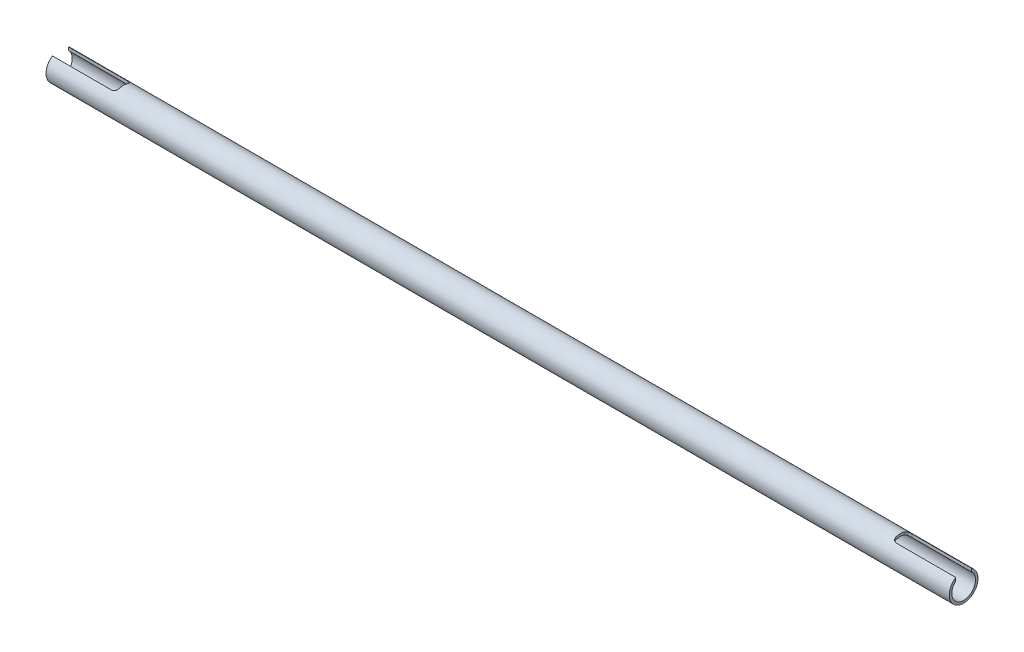
ISO-10303-21;
HEADER;
FILE_DESCRIPTION(('STEP AP214'),'2;1');
FILE_NAME('part.step','',(''),(''),'','','');
FILE_SCHEMA(('AUTOMOTIVE_DESIGN { 1 0 10303 214 1 1 1 1 }'));
ENDSEC;
DATA;
#1=APPLICATION_CONTEXT('core data for automotive mechanical design processes');
#2=APPLICATION_PROTOCOL_DEFINITION('international standard','automotive_design',2000,#1);
#3=PRODUCT_CONTEXT('',#1,'mechanical');
#4=PRODUCT('Part','Part','',(#3));
#5=PRODUCT_RELATED_PRODUCT_CATEGORY('part','',(#4));
#6=PRODUCT_DEFINITION_FORMATION('','',#4);
#7=PRODUCT_DEFINITION_CONTEXT('part definition',#1,'design');
#8=PRODUCT_DEFINITION('design','',#6,#7);
#9=PRODUCT_DEFINITION_SHAPE('','',#8);
#10=(LENGTH_UNIT() NAMED_UNIT(*) SI_UNIT(.MILLI.,.METRE.));
#11=(NAMED_UNIT(*) PLANE_ANGLE_UNIT() SI_UNIT($,.RADIAN.));
#12=(NAMED_UNIT(*) SI_UNIT($,.STERADIAN.) SOLID_ANGLE_UNIT());
#13=UNCERTAINTY_MEASURE_WITH_UNIT(LENGTH_MEASURE(1.E-05),#10,'distance_accuracy_value','');
#14=(GEOMETRIC_REPRESENTATION_CONTEXT(3) GLOBAL_UNCERTAINTY_ASSIGNED_CONTEXT((#13)) GLOBAL_UNIT_ASSIGNED_CONTEXT((#10,
#11,#12)) REPRESENTATION_CONTEXT('',''));
#15=CARTESIAN_POINT('',(0.,0.,0.));
#16=DIRECTION('',(0.,0.,1.));
#17=DIRECTION('',(1.,0.,0.));
#18=AXIS2_PLACEMENT_3D('',#15,#16,#17);
#19=CARTESIAN_POINT('',(362.5,0.,0.));
#20=DIRECTION('',(1.,0.,0.));
#21=DIRECTION('',(0.,0.,-1.));
#22=AXIS2_PLACEMENT_3D('',#19,#20,#21);
#23=PLANE('',#22);
#24=CARTESIAN_POINT('',(362.5,0.,0.));
#25=DIRECTION('',(1.,0.,0.));
#26=DIRECTION('',(0.,0.,-1.));
#27=AXIS2_PLACEMENT_3D('',#24,#25,#26);
#28=CIRCLE('',#27,9.525);
#29=CARTESIAN_POINT('',(362.5,7.09951582856183,6.35));
#30=VERTEX_POINT('',#29);
#31=CARTESIAN_POINT('',(362.5,7.09951582856183,-6.35));
#32=VERTEX_POINT('',#31);
#33=EDGE_CURVE('E227',#30,#32,#28,.T.);
#34=ORIENTED_EDGE('',*,*,#33,.F.);
#35=DIRECTION('',(0.,-1.,0.));
#36=VECTOR('',#35,1.);
#37=CARTESIAN_POINT('',(362.5,23.,6.35));
#38=LINE('',#37,#36);
#39=CARTESIAN_POINT('',(362.5,9.61785449047759,6.35));
#40=VERTEX_POINT('',#39);
#41=EDGE_CURVE('E251',#40,#30,#38,.T.);
#42=ORIENTED_EDGE('',*,*,#41,.F.);
#43=CARTESIAN_POINT('',(362.5,0.,0.));
#44=DIRECTION('',(1.,0.,0.));
#45=DIRECTION('',(0.,0.,-1.));
#46=AXIS2_PLACEMENT_3D('',#43,#44,#45);
#47=CIRCLE('',#46,11.525);
#48=CARTESIAN_POINT('',(362.5,9.61785449047759,-6.35));
#49=VERTEX_POINT('',#48);
#50=EDGE_CURVE('E226',#40,#49,#47,.T.);
#51=ORIENTED_EDGE('',*,*,#50,.T.);
#52=DIRECTION('',(0.,-1.,0.));
#53=VECTOR('',#52,1.);
#54=CARTESIAN_POINT('',(362.5,23.,-6.35));
#55=LINE('',#54,#53);
#56=EDGE_CURVE('E244',#49,#32,#55,.T.);
#57=ORIENTED_EDGE('',*,*,#56,.T.);
#58=EDGE_LOOP('',(#34,#42,#51,#57));
#59=FACE_BOUND('',#58,.T.);
#60=ADVANCED_FACE('F38',(#59),#23,.T.);
#61=CARTESIAN_POINT('',(362.5,0.,0.));
#62=DIRECTION('',(-1.,0.,0.));
#63=DIRECTION('',(0.,0.,1.));
#64=AXIS2_PLACEMENT_3D('',#61,#62,#63);
#65=CYLINDRICAL_SURFACE('',#64,11.525);
#66=CARTESIAN_POINT('',(-362.5,0.,0.));
#67=DIRECTION('',(1.,0.,0.));
#68=DIRECTION('',(0.,0.,-1.));
#69=AXIS2_PLACEMENT_3D('',#66,#67,#68);
#70=CIRCLE('',#69,11.525);
#71=CARTESIAN_POINT('',(-362.5,9.61785449047759,6.35));
#72=VERTEX_POINT('',#71);
#73=CARTESIAN_POINT('',(-362.5,9.61785449047759,-6.35));
#74=VERTEX_POINT('',#73);
#75=EDGE_CURVE('E220',#72,#74,#70,.T.);
#76=ORIENTED_EDGE('',*,*,#75,.T.);
#77=DIRECTION('',(-1.,0.,0.));
#78=VECTOR('',#77,1.);
#79=CARTESIAN_POINT('',(362.5,9.61785449047759,-6.35));
#80=LINE('',#79,#78);
#81=CARTESIAN_POINT('',(-314.7,9.61785449047759,-6.35));
#82=VERTEX_POINT('',#81);
#83=EDGE_CURVE('E225',#74,#82,#80,.F.);
#84=ORIENTED_EDGE('',*,*,#83,.T.);
#85=CARTESIAN_POINT('',(-314.7,9.61785449047759,-6.35));
#86=CARTESIAN_POINT('',(-314.62412960931,9.61783719008871,-6.35001472411667));
#87=CARTESIAN_POINT('',(-314.54827077058,9.61975425390792,-6.34712232960108));
#88=CARTESIAN_POINT('',(-314.3972164236,9.6273259624087,-6.33563774736336));
#89=CARTESIAN_POINT('',(-314.322020555645,9.63297843544727,-6.32704887137609));
#90=CARTESIAN_POINT('',(-314.173292998488,9.64784509930453,-6.30435421613493));
#91=CARTESIAN_POINT('',(-314.099754004671,9.65703758917539,-6.29028204438159));
#92=CARTESIAN_POINT('',(-313.954408404781,9.67874466115362,-6.25683016434463));
#93=CARTESIAN_POINT('',(-313.882601975339,9.69125958042864,-6.2374499173792));
#94=CARTESIAN_POINT('',(-313.670785610698,9.73331230611268,-6.17178841932299));
#95=CARTESIAN_POINT('',(-313.533941576399,9.76740431728918,-6.11791795596803));
#96=CARTESIAN_POINT('',(-313.271649200573,9.84504819496624,-5.99216901227246));
#97=CARTESIAN_POINT('',(-313.146217923362,9.88861390722428,-5.92026415092508));
#98=CARTESIAN_POINT('',(-312.898739976851,9.98631689231128,-5.75405301697405));
#99=CARTESIAN_POINT('',(-312.777839271345,10.0410316107989,-5.65838237134446));
#100=CARTESIAN_POINT('',(-312.553150852299,10.1550781405946,-5.45105734997949));
#101=CARTESIAN_POINT('',(-312.449371591058,10.2144122111794,-5.33939513023337));
#102=CARTESIAN_POINT('',(-312.2465423585,10.3436090390283,-5.08512494753548));
#103=CARTESIAN_POINT('',(-312.150341627472,10.4137544869434,-4.94037681869321));
#104=CARTESIAN_POINT('',(-311.984115861906,10.5527373731332,-4.63609012273654));
#105=CARTESIAN_POINT('',(-311.914080864379,10.6215752997702,-4.47655721408168));
#106=CARTESIAN_POINT('',(-311.806547118443,10.7498163622024,-4.1586214014769));
#107=CARTESIAN_POINT('',(-311.766979253961,10.8095388926176,-4.00105501246837));
#108=CARTESIAN_POINT('',(-311.727020190474,10.8947568249706,-3.7599498811021));
#109=CARTESIAN_POINT('',(-311.716932267182,10.9224610864076,-3.67870391729896));
#110=CARTESIAN_POINT('',(-311.703420935863,10.9762135146012,-3.51508164635891));
#111=CARTESIAN_POINT('',(-311.700000298136,11.0022609886054,-3.43270488367787));
#112=CARTESIAN_POINT('',(-311.7,11.0273806953419,-3.35000000000001));
#113=B_SPLINE_CURVE_WITH_KNOTS('',3,(#85,#86,#87,#88,#89,#90,#91,#92,#93,#94,#95,#96,#97,#98,
#99,#100,#101,#102,#103,#104,#105,#106,#107,#108,#109,#110,#111,#112),.UNSPECIFIED.,.F.,.F.,(4,
2,2,2,2,2,2,2,2,2,2,2,2,4),(0.,0.227512894422188,0.454893636618366,0.680902129078979,
0.906933566165684,1.35767920180695,1.80908808076627,2.29798152095593,2.78711559437471,
3.34691433939575,3.90649971503392,4.42353402025813,4.68257823588544,4.94173006312893),.UNSPECIFIED.);
#114=CARTESIAN_POINT('',(-311.7,11.0273806953419,-3.35));
#115=VERTEX_POINT('',#114);
#116=EDGE_CURVE('E159',#82,#115,#113,.T.);
#117=ORIENTED_EDGE('',*,*,#116,.T.);
#118=CARTESIAN_POINT('',(-311.7,0.,0.));
#119=DIRECTION('',(1.,0.,0.));
#120=DIRECTION('',(0.,0.,-1.));
#121=AXIS2_PLACEMENT_3D('',#118,#119,#120);
#122=CIRCLE('',#121,11.525);
#123=CARTESIAN_POINT('',(-311.7,11.0273806953419,3.35));
#124=VERTEX_POINT('',#123);
#125=EDGE_CURVE('E155',#115,#124,#122,.T.);
#126=ORIENTED_EDGE('',*,*,#125,.T.);
#127=CARTESIAN_POINT('',(-311.7,11.0273806953419,3.35));
#128=CARTESIAN_POINT('',(-311.699993208499,11.0001263085442,3.43975217585381));
#129=CARTESIAN_POINT('',(-311.704027212755,10.9717618693023,3.52914500616861));
#130=CARTESIAN_POINT('',(-311.719934401097,10.9131020957586,3.70654634253026));
#131=CARTESIAN_POINT('',(-311.731803958667,10.8828076605708,3.79455546971065));
#132=CARTESIAN_POINT('',(-311.763095785526,10.8206397797251,3.96836081202152));
#133=CARTESIAN_POINT('',(-311.782496511445,10.7887710623248,4.0541626015112));
#134=CARTESIAN_POINT('',(-311.82857038764,10.7237094949895,4.22325730293904));
#135=CARTESIAN_POINT('',(-311.855244320164,10.6905165029541,4.30654994394265));
#136=CARTESIAN_POINT('',(-311.94567754982,10.58957801452,4.55165066080173));
#137=CARTESIAN_POINT('',(-312.019926278698,10.5203198786257,4.70910536853686));
#138=CARTESIAN_POINT('',(-312.194275291003,10.3810113305893,5.00875725376151));
#139=CARTESIAN_POINT('',(-312.294408333043,10.3109600228368,5.15093477161695));
#140=CARTESIAN_POINT('',(-312.5236424303,10.1707080438531,5.42279760428362));
#141=CARTESIAN_POINT('',(-312.653848636423,10.1006438547074,5.5516273229986));
#142=CARTESIAN_POINT('',(-312.938052258396,9.96881586884745,5.78500737848692));
#143=CARTESIAN_POINT('',(-313.09202438018,9.90704337646225,5.88958323591414));
#144=CARTESIAN_POINT('',(-313.386236237145,9.80900621875348,6.0511182034491));
#145=CARTESIAN_POINT('',(-313.522652945437,9.77010852572037,6.11345867654304));
#146=CARTESIAN_POINT('',(-313.805678692531,9.70420466035408,6.21754395162758));
#147=CARTESIAN_POINT('',(-313.952264469234,9.67717232091228,6.25933409878355));
#148=CARTESIAN_POINT('',(-314.199749147572,9.64438338940511,6.30968062199532));
#149=CARTESIAN_POINT('',(-314.298826142137,9.63449793434078,6.32473908429372));
#150=CARTESIAN_POINT('',(-314.49857408183,9.62120627862089,6.34492369432358));
#151=CARTESIAN_POINT('',(-314.599247361353,9.61781066281704,6.35003361635539));
#152=CARTESIAN_POINT('',(-314.7,9.61785449047759,6.35));
#153=B_SPLINE_CURVE_WITH_KNOTS('',3,(#127,#128,#129,#130,#131,#132,#133,#134,#135,#136,#137,
#138,#139,#140,#141,#142,#143,#144,#145,#146,#147,#148,#149,#150,#151,#152),.UNSPECIFIED.,.F.,
.F.,(4,2,2,2,2,2,2,2,2,2,2,2,4),(0.,0.281270895631947,0.562411702341072,0.842754145409989,
1.12312675176706,1.6825164674415,2.24261763024737,2.82804584304815,3.41285522696497,
3.87581629897958,4.33775119200564,4.63918880793522,4.94111764692505),.UNSPECIFIED.);
#154=CARTESIAN_POINT('',(-314.7,9.61785449047759,6.35));
#155=VERTEX_POINT('',#154);
#156=EDGE_CURVE('E146',#124,#155,#153,.T.);
#157=ORIENTED_EDGE('',*,*,#156,.T.);
#158=DIRECTION('',(-1.,0.,0.));
#159=VECTOR('',#158,1.);
#160=CARTESIAN_POINT('',(362.5,9.61785449047759,6.35));
#161=LINE('',#160,#159);
#162=EDGE_CURVE('E132',#155,#72,#161,.T.);
#163=ORIENTED_EDGE('',*,*,#162,.T.);
#164=EDGE_LOOP('',(#76,#84,#117,#126,#157,#163));
#165=FACE_BOUND('',#164,.T.);
#166=DIRECTION('',(-1.,0.,0.));
#167=VECTOR('',#166,1.);
#168=CARTESIAN_POINT('',(362.5,9.61785449047759,6.35));
#169=LINE('',#168,#167);
#170=CARTESIAN_POINT('',(314.7,9.61785449047759,6.35));
#171=VERTEX_POINT('',#170);
#172=EDGE_CURVE('E392',#171,#40,#169,.F.);
#173=ORIENTED_EDGE('',*,*,#172,.F.);
#174=CARTESIAN_POINT('',(311.7,11.0273806953419,3.35));
#175=CARTESIAN_POINT('',(311.699993208499,11.0001263085442,3.43975217585381));
#176=CARTESIAN_POINT('',(311.704027212755,10.9717618693023,3.52914500616861));
#177=CARTESIAN_POINT('',(311.719934401097,10.9131020957586,3.70654634253026));
#178=CARTESIAN_POINT('',(311.731803958667,10.8828076605708,3.79455546971065));
#179=CARTESIAN_POINT('',(311.763095785526,10.8206397797251,3.96836081202152));
#180=CARTESIAN_POINT('',(311.782496511445,10.7887710623248,4.0541626015112));
#181=CARTESIAN_POINT('',(311.82857038764,10.7237094949895,4.22325730293904));
#182=CARTESIAN_POINT('',(311.855244320164,10.6905165029541,4.30654994394265));
#183=CARTESIAN_POINT('',(311.94567754982,10.58957801452,4.55165066080173));
#184=CARTESIAN_POINT('',(312.019926278698,10.5203198786257,4.70910536853686));
#185=CARTESIAN_POINT('',(312.194275291003,10.3810113305893,5.00875725376151));
#186=CARTESIAN_POINT('',(312.294408333043,10.3109600228368,5.15093477161695));
#187=CARTESIAN_POINT('',(312.5236424303,10.1707080438531,5.42279760428362));
#188=CARTESIAN_POINT('',(312.653848636423,10.1006438547074,5.55162732299859));
#189=CARTESIAN_POINT('',(312.938052258396,9.96881586884745,5.78500737848692));
#190=CARTESIAN_POINT('',(313.09202438018,9.90704337646226,5.88958323591413));
#191=CARTESIAN_POINT('',(313.386236237145,9.80900621875348,6.0511182034491));
#192=CARTESIAN_POINT('',(313.522652945437,9.77010852572037,6.11345867654304));
#193=CARTESIAN_POINT('',(313.805678692531,9.70420466035408,6.21754395162758));
#194=CARTESIAN_POINT('',(313.952264469234,9.67717232091228,6.25933409878355));
#195=CARTESIAN_POINT('',(314.199749147572,9.64438338940511,6.30968062199532));
#196=CARTESIAN_POINT('',(314.298826142137,9.63449793434078,6.32473908429372));
#197=CARTESIAN_POINT('',(314.49857408183,9.62120627862089,6.34492369432358));
#198=CARTESIAN_POINT('',(314.599247361353,9.61781066281704,6.35003361635539));
#199=CARTESIAN_POINT('',(314.7,9.61785449047759,6.35));
#200=B_SPLINE_CURVE_WITH_KNOTS('',3,(#174,#175,#176,#177,#178,#179,#180,#181,#182,#183,#184,
#185,#186,#187,#188,#189,#190,#191,#192,#193,#194,#195,#196,#197,#198,#199),.UNSPECIFIED.,.F.,
.F.,(4,2,2,2,2,2,2,2,2,2,2,2,4),(0.,0.281270895631947,0.562411702341071,0.842754145409988,
1.12312675176706,1.6825164674415,2.24261763024737,2.82804584304814,3.41285522696497,
3.87581629897958,4.33775119200564,4.63918880793522,4.94111764692505),.UNSPECIFIED.);
#201=CARTESIAN_POINT('',(311.7,11.0273806953419,3.35));
#202=VERTEX_POINT('',#201);
#203=EDGE_CURVE('E391',#202,#171,#200,.T.);
#204=ORIENTED_EDGE('',*,*,#203,.F.);
#205=CARTESIAN_POINT('',(311.7,0.,0.));
#206=DIRECTION('',(1.,0.,0.));
#207=DIRECTION('',(0.,0.,-1.));
#208=AXIS2_PLACEMENT_3D('',#205,#206,#207);
#209=CIRCLE('',#208,11.525);
#210=CARTESIAN_POINT('',(311.7,11.0273806953419,-3.35));
#211=VERTEX_POINT('',#210);
#212=EDGE_CURVE('E259',#211,#202,#209,.T.);
#213=ORIENTED_EDGE('',*,*,#212,.F.);
#214=CARTESIAN_POINT('',(314.7,9.61785449047759,-6.35));
#215=CARTESIAN_POINT('',(314.62412960931,9.61783719008871,-6.35001472411667));
#216=CARTESIAN_POINT('',(314.54827077058,9.61975425390792,-6.34712232960108));
#217=CARTESIAN_POINT('',(314.3972164236,9.6273259624087,-6.33563774736336));
#218=CARTESIAN_POINT('',(314.322020555645,9.63297843544727,-6.32704887137609));
#219=CARTESIAN_POINT('',(314.173292998488,9.64784509930453,-6.30435421613493));
#220=CARTESIAN_POINT('',(314.099754004671,9.65703758917539,-6.29028204438159));
#221=CARTESIAN_POINT('',(313.954408404781,9.67874466115362,-6.25683016434463));
#222=CARTESIAN_POINT('',(313.882601975339,9.69125958042864,-6.2374499173792));
#223=CARTESIAN_POINT('',(313.670785610698,9.73331230611268,-6.17178841932299));
#224=CARTESIAN_POINT('',(313.533941576399,9.76740431728918,-6.11791795596803));
#225=CARTESIAN_POINT('',(313.271649200573,9.84504819496624,-5.99216901227246));
#226=CARTESIAN_POINT('',(313.146217923362,9.88861390722428,-5.92026415092508));
#227=CARTESIAN_POINT('',(312.898739976851,9.98631689231128,-5.75405301697405));
#228=CARTESIAN_POINT('',(312.777839271345,10.0410316107989,-5.65838237134446));
#229=CARTESIAN_POINT('',(312.553150852299,10.1550781405946,-5.45105734997949));
#230=CARTESIAN_POINT('',(312.449371591058,10.2144122111794,-5.33939513023337));
#231=CARTESIAN_POINT('',(312.2465423585,10.3436090390283,-5.08512494753548));
#232=CARTESIAN_POINT('',(312.150341627472,10.4137544869434,-4.94037681869321));
#233=CARTESIAN_POINT('',(311.984115861906,10.5527373731332,-4.63609012273654));
#234=CARTESIAN_POINT('',(311.914080864379,10.6215752997702,-4.47655721408168));
#235=CARTESIAN_POINT('',(311.806547118443,10.7498163622024,-4.1586214014769));
#236=CARTESIAN_POINT('',(311.766979253961,10.8095388926176,-4.00105501246837));
#237=CARTESIAN_POINT('',(311.727020190474,10.8947568249706,-3.7599498811021));
#238=CARTESIAN_POINT('',(311.716932267182,10.9224610864076,-3.67870391729896));
#239=CARTESIAN_POINT('',(311.703420935863,10.9762135146012,-3.51508164635891));
#240=CARTESIAN_POINT('',(311.700000298136,11.0022609886054,-3.43270488367787));
#241=CARTESIAN_POINT('',(311.7,11.0273806953419,-3.35000000000001));
#242=B_SPLINE_CURVE_WITH_KNOTS('',3,(#214,#215,#216,#217,#218,#219,#220,#221,#222,#223,#224,
#225,#226,#227,#228,#229,#230,#231,#232,#233,#234,#235,#236,#237,#238,#239,#240,#241),
.UNSPECIFIED.,.F.,.F.,(4,2,2,2,2,2,2,2,2,2,2,2,2,4),(0.,0.227512894422188,0.454893636618366,
0.680902129078979,0.906933566165684,1.35767920180695,1.80908808076627,2.29798152095593,
2.78711559437471,3.34691433939575,3.90649971503392,4.42353402025813,4.68257823588544,
4.94173006312893),.UNSPECIFIED.);
#243=CARTESIAN_POINT('',(314.7,9.61785449047759,-6.35));
#244=VERTEX_POINT('',#243);
#245=EDGE_CURVE('E261',#244,#211,#242,.T.);
#246=ORIENTED_EDGE('',*,*,#245,.F.);
#247=DIRECTION('',(-1.,0.,0.));
#248=VECTOR('',#247,1.);
#249=CARTESIAN_POINT('',(362.5,9.61785449047759,-6.35));
#250=LINE('',#249,#248);
#251=EDGE_CURVE('E267',#49,#244,#250,.T.);
#252=ORIENTED_EDGE('',*,*,#251,.F.);
#253=ORIENTED_EDGE('',*,*,#50,.F.);
#254=EDGE_LOOP('',(#173,#204,#213,#246,#252,#253));
#255=FACE_BOUND('',#254,.T.);
#256=ADVANCED_FACE('F40',(#165,#255),#65,.T.);
#257=CARTESIAN_POINT('',(362.5,0.,0.));
#258=DIRECTION('',(-1.,0.,0.));
#259=DIRECTION('',(0.,0.,1.));
#260=AXIS2_PLACEMENT_3D('',#257,#258,#259);
#261=CYLINDRICAL_SURFACE('',#260,9.525);
#262=DIRECTION('',(-1.,0.,0.));
#263=VECTOR('',#262,1.);
#264=CARTESIAN_POINT('',(362.5,7.09951582856183,-6.35));
#265=LINE('',#264,#263);
#266=CARTESIAN_POINT('',(-362.5,7.09951582856183,-6.35));
#267=VERTEX_POINT('',#266);
#268=CARTESIAN_POINT('',(-314.7,7.09951582856183,-6.35));
#269=VERTEX_POINT('',#268);
#270=EDGE_CURVE('E141',#267,#269,#265,.F.);
#271=ORIENTED_EDGE('',*,*,#270,.F.);
#272=CARTESIAN_POINT('',(-362.5,0.,0.));
#273=DIRECTION('',(1.,0.,0.));
#274=DIRECTION('',(0.,0.,-1.));
#275=AXIS2_PLACEMENT_3D('',#272,#273,#274);
#276=CIRCLE('',#275,9.525);
#277=CARTESIAN_POINT('',(-362.5,7.09951582856183,6.35));
#278=VERTEX_POINT('',#277);
#279=EDGE_CURVE('E221',#278,#267,#276,.T.);
#280=ORIENTED_EDGE('',*,*,#279,.F.);
#281=DIRECTION('',(-1.,0.,0.));
#282=VECTOR('',#281,1.);
#283=CARTESIAN_POINT('',(362.5,7.09951582856183,6.35));
#284=LINE('',#283,#282);
#285=CARTESIAN_POINT('',(-314.7,7.09951582856183,6.35));
#286=VERTEX_POINT('',#285);
#287=EDGE_CURVE('E60',#286,#278,#284,.T.);
#288=ORIENTED_EDGE('',*,*,#287,.F.);
#289=CARTESIAN_POINT('',(-311.7,8.91645248963959,3.35));
#290=CARTESIAN_POINT('',(-311.69999419947,8.8818133827646,3.44223674694686));
#291=CARTESIAN_POINT('',(-311.70425295962,8.84572840474698,3.53389568235868));
#292=CARTESIAN_POINT('',(-311.720940031107,8.77104768551315,3.7153594717705));
#293=CARTESIAN_POINT('',(-311.733362657839,8.73245370818274,3.80516557107828));
#294=CARTESIAN_POINT('',(-311.765945416305,8.65326531770397,3.98195674716842));
#295=CARTESIAN_POINT('',(-311.786070487711,8.61268068505288,4.06895269741342));
#296=CARTESIAN_POINT('',(-311.833690056649,8.52976000706419,4.24003202532091));
#297=CARTESIAN_POINT('',(-311.861185823325,8.48742366116595,4.32411489856941));
#298=CARTESIAN_POINT('',(-311.9540396367,8.35865211019002,4.57086370919536));
#299=CARTESIAN_POINT('',(-312.029882736928,8.27017249079528,4.72865270482178));
#300=CARTESIAN_POINT('',(-312.207303316797,8.09146315822358,5.02836422927802));
#301=CARTESIAN_POINT('',(-312.308940195304,8.00122985561017,5.17024903104908));
#302=CARTESIAN_POINT('',(-312.545576273424,7.81626332210504,5.44622731548924));
#303=CARTESIAN_POINT('',(-312.682623308474,7.72176508014306,5.57873616702757));
#304=CARTESIAN_POINT('',(-312.983482026674,7.54322946007962,5.81786165218977));
#305=CARTESIAN_POINT('',(-313.147240701975,7.45917193333469,5.92452854657346));
#306=CARTESIAN_POINT('',(-313.443470340225,7.33455526577063,6.07753215774176));
#307=CARTESIAN_POINT('',(-313.569369255277,7.28865863957872,6.13227122003551));
#308=CARTESIAN_POINT('',(-313.830891218717,7.20990597404448,6.22467516710594));
#309=CARTESIAN_POINT('',(-313.966482674094,7.17700966066748,6.26239283530609));
#310=CARTESIAN_POINT('',(-314.202090418856,7.13510501710948,6.31003760122699));
#311=CARTESIAN_POINT('',(-314.300363638329,7.12187265268512,6.32493010847517));
#312=CARTESIAN_POINT('',(-314.449265744603,7.10851914587797,6.33992286420476));
#313=CARTESIAN_POINT('',(-314.499261355536,7.10515027868153,6.34369626505408));
#314=CARTESIAN_POINT('',(-314.599500440839,7.10064571075004,6.34873692594193));
#315=CARTESIAN_POINT('',(-314.649744013545,7.0995109817958,6.35000309541398));
#316=CARTESIAN_POINT('',(-314.7,7.09951582856183,6.35));
#317=B_SPLINE_CURVE_WITH_KNOTS('',3,(#289,#290,#291,#292,#293,#294,#295,#296,#297,#298,#299,
#300,#301,#302,#303,#304,#305,#306,#307,#308,#309,#310,#311,#312,#313,#314,#315,#316),
.UNSPECIFIED.,.F.,.F.,(4,2,2,2,2,2,2,2,2,2,2,2,2,4),(0.,0.295427016411927,0.590648540845026,
0.884541944648256,1.17848598579095,1.76431676351331,2.35150905344247,2.98669419011853,
3.62063383673795,4.05331509888894,4.48464523595347,4.78460200076217,4.93525196988146,
5.08596745259809),.UNSPECIFIED.);
#318=CARTESIAN_POINT('',(-311.7,8.91645248963959,3.35));
#319=VERTEX_POINT('',#318);
#320=EDGE_CURVE('E149',#319,#286,#317,.T.);
#321=ORIENTED_EDGE('',*,*,#320,.F.);
#322=CARTESIAN_POINT('',(-311.7,0.,0.));
#323=DIRECTION('',(1.,0.,0.));
#324=DIRECTION('',(0.,0.,-1.));
#325=AXIS2_PLACEMENT_3D('',#322,#323,#324);
#326=CIRCLE('',#325,9.525);
#327=CARTESIAN_POINT('',(-311.7,8.91645248963959,-3.35));
#328=VERTEX_POINT('',#327);
#329=EDGE_CURVE('E53',#328,#319,#326,.T.);
#330=ORIENTED_EDGE('',*,*,#329,.F.);
#331=CARTESIAN_POINT('',(-314.7,7.09951582856183,-6.35));
#332=CARTESIAN_POINT('',(-314.628390232265,7.0994899573347,-6.35001769397443));
#333=CARTESIAN_POINT('',(-314.556797812089,7.10180832665333,-6.34743670790289));
#334=CARTESIAN_POINT('',(-314.414331380451,7.11093530961771,-6.33721615513459));
#335=CARTESIAN_POINT('',(-314.34345673377,7.11773952109074,-6.32958154776992));
#336=CARTESIAN_POINT('',(-314.203622533591,7.13555711341919,-6.30948626904966));
#337=CARTESIAN_POINT('',(-314.134651279064,7.14653061014128,-6.29707131269739));
#338=CARTESIAN_POINT('',(-313.998443240532,7.17234819663722,-6.26764952518838));
#339=CARTESIAN_POINT('',(-313.931206801296,7.18719304937186,-6.25064178887029));
#340=CARTESIAN_POINT('',(-313.733243647496,7.23682336250806,-6.19326778435097));
#341=CARTESIAN_POINT('',(-313.605612907853,7.27679339891072,-6.14645369508387));
#342=CARTESIAN_POINT('',(-313.360681968999,7.36719411020138,-6.03780376343484));
#343=CARTESIAN_POINT('',(-313.243412376624,7.41765439178555,-5.97592531838702));
#344=CARTESIAN_POINT('',(-312.976960316844,7.54682127131796,-5.81254682578315));
#345=CARTESIAN_POINT('',(-312.833095550896,7.62888249832065,-5.70499554048867));
#346=CARTESIAN_POINT('',(-312.568736430176,7.79996313575545,-5.46877833150821));
#347=CARTESIAN_POINT('',(-312.448272105942,7.88899128429844,-5.34008566202805));
#348=CARTESIAN_POINT('',(-312.230679499167,8.06975267487284,-5.06284636644103));
#349=CARTESIAN_POINT('',(-312.133841794811,8.16150540439471,-4.91408438601498));
#350=CARTESIAN_POINT('',(-311.967437154291,8.34211658106605,-4.60079667144817));
#351=CARTESIAN_POINT('',(-311.897821196621,8.43097996424495,-4.43629994414141));
#352=CARTESIAN_POINT('',(-311.796630919955,8.58917173479988,-4.12043919172949));
#353=CARTESIAN_POINT('',(-311.760881700234,8.65941590781578,-3.9708816675839));
#354=CARTESIAN_POINT('',(-311.72463956736,8.75979385344815,-3.74147795952469));
#355=CARTESIAN_POINT('',(-311.715455141673,8.79246723319337,-3.66404497230159));
#356=CARTESIAN_POINT('',(-311.703133688538,8.85592878991926,-3.50788767058444));
#357=CARTESIAN_POINT('',(-311.700000005344,8.88671591526829,-3.42916266621668));
#358=CARTESIAN_POINT('',(-311.7,8.91645248963959,-3.35));
#359=B_SPLINE_CURVE_WITH_KNOTS('',3,(#331,#332,#333,#334,#335,#336,#337,#338,#339,#340,#341,
#342,#343,#344,#345,#346,#347,#348,#349,#350,#351,#352,#353,#354,#355,#356,#357,#358),
.UNSPECIFIED.,.F.,.F.,(4,2,2,2,2,2,2,2,2,2,2,2,2,4),(0.,0.214717200178695,0.429224001065765,
0.641728450073734,0.854274810816653,1.27740345086943,1.70174290913525,2.29105350527228,
2.88111545738386,3.47810495661701,4.07401437796675,4.57931100382107,4.83272414441315,
5.0862773067596),.UNSPECIFIED.);
#360=EDGE_CURVE('E12',#269,#328,#359,.T.);
#361=ORIENTED_EDGE('',*,*,#360,.F.);
#362=EDGE_LOOP('',(#271,#280,#288,#321,#330,#361));
#363=FACE_BOUND('',#362,.T.);
#364=CARTESIAN_POINT('',(311.7,8.91645248963959,3.35));
#365=CARTESIAN_POINT('',(311.69999419947,8.88181338276459,3.44223674694686));
#366=CARTESIAN_POINT('',(311.70425295962,8.84572840474698,3.53389568235868));
#367=CARTESIAN_POINT('',(311.720940031107,8.77104768551315,3.7153594717705));
#368=CARTESIAN_POINT('',(311.733362657839,8.73245370818274,3.80516557107828));
#369=CARTESIAN_POINT('',(311.765945416305,8.65326531770397,3.98195674716842));
#370=CARTESIAN_POINT('',(311.786070487711,8.61268068505287,4.06895269741343));
#371=CARTESIAN_POINT('',(311.833690056649,8.52976000706419,4.24003202532092));
#372=CARTESIAN_POINT('',(311.861185823325,8.48742366116595,4.32411489856941));
#373=CARTESIAN_POINT('',(311.9540396367,8.35865211019003,4.57086370919536));
#374=CARTESIAN_POINT('',(312.029882736928,8.27017249079528,4.72865270482178));
#375=CARTESIAN_POINT('',(312.207303316797,8.09146315822358,5.02836422927802));
#376=CARTESIAN_POINT('',(312.308940195304,8.00122985561017,5.17024903104908));
#377=CARTESIAN_POINT('',(312.545576273424,7.81626332210505,5.44622731548922));
#378=CARTESIAN_POINT('',(312.682623308473,7.72176508014308,5.57873616702755));
#379=CARTESIAN_POINT('',(312.983482026674,7.54322946007964,5.81786165218975));
#380=CARTESIAN_POINT('',(313.147240701975,7.45917193333469,5.92452854657345));
#381=CARTESIAN_POINT('',(313.443470340225,7.33455526577063,6.07753215774176));
#382=CARTESIAN_POINT('',(313.569369255277,7.28865863957872,6.13227122003551));
#383=CARTESIAN_POINT('',(313.830891218717,7.20990597404448,6.22467516710594));
#384=CARTESIAN_POINT('',(313.966482674094,7.17700966066748,6.26239283530609));
#385=CARTESIAN_POINT('',(314.202090418856,7.13510501710948,6.31003760122699));
#386=CARTESIAN_POINT('',(314.300363638329,7.12187265268512,6.32493010847517));
#387=CARTESIAN_POINT('',(314.449265744603,7.10851914587797,6.33992286420476));
#388=CARTESIAN_POINT('',(314.499261355536,7.10515027868153,6.34369626505408));
#389=CARTESIAN_POINT('',(314.599500440839,7.10064571075004,6.34873692594193));
#390=CARTESIAN_POINT('',(314.649744013545,7.0995109817958,6.35000309541398));
#391=CARTESIAN_POINT('',(314.7,7.09951582856183,6.35));
#392=B_SPLINE_CURVE_WITH_KNOTS('',3,(#364,#365,#366,#367,#368,#369,#370,#371,#372,#373,#374,
#375,#376,#377,#378,#379,#380,#381,#382,#383,#384,#385,#386,#387,#388,#389,#390,#391),
.UNSPECIFIED.,.F.,.F.,(4,2,2,2,2,2,2,2,2,2,2,2,2,4),(0.,0.295427016411927,0.590648540845024,
0.884541944648268,1.17848598579096,1.76431676351332,2.35150905344247,2.98669419011846,
3.62063383673795,4.05331509888894,4.48464523595347,4.78460200076217,4.93525196988146,
5.0859674525981),.UNSPECIFIED.);
#393=CARTESIAN_POINT('',(311.7,8.91645248963959,3.35));
#394=VERTEX_POINT('',#393);
#395=CARTESIAN_POINT('',(314.7,7.09951582856183,6.35));
#396=VERTEX_POINT('',#395);
#397=EDGE_CURVE('E206',#394,#396,#392,.T.);
#398=ORIENTED_EDGE('',*,*,#397,.T.);
#399=DIRECTION('',(-1.,0.,0.));
#400=VECTOR('',#399,1.);
#401=CARTESIAN_POINT('',(362.5,7.09951582856183,6.35));
#402=LINE('',#401,#400);
#403=EDGE_CURVE('E213',#396,#30,#402,.F.);
#404=ORIENTED_EDGE('',*,*,#403,.T.);
#405=ORIENTED_EDGE('',*,*,#33,.T.);
#406=DIRECTION('',(-1.,0.,0.));
#407=VECTOR('',#406,1.);
#408=CARTESIAN_POINT('',(362.5,7.09951582856183,-6.35));
#409=LINE('',#408,#407);
#410=CARTESIAN_POINT('',(314.7,7.09951582856183,-6.35));
#411=VERTEX_POINT('',#410);
#412=EDGE_CURVE('E214',#32,#411,#409,.T.);
#413=ORIENTED_EDGE('',*,*,#412,.T.);
#414=CARTESIAN_POINT('',(314.7,7.09951582856183,-6.35));
#415=CARTESIAN_POINT('',(314.628390232265,7.0994899573347,-6.35001769397443));
#416=CARTESIAN_POINT('',(314.556797812089,7.10180832665333,-6.34743670790289));
#417=CARTESIAN_POINT('',(314.414331380451,7.11093530961771,-6.33721615513459));
#418=CARTESIAN_POINT('',(314.34345673377,7.11773952109074,-6.32958154776992));
#419=CARTESIAN_POINT('',(314.203622533591,7.13555711341919,-6.30948626904966));
#420=CARTESIAN_POINT('',(314.134651279064,7.14653061014128,-6.29707131269739));
#421=CARTESIAN_POINT('',(313.998443240532,7.17234819663722,-6.26764952518838));
#422=CARTESIAN_POINT('',(313.931206801296,7.18719304937186,-6.25064178887029));
#423=CARTESIAN_POINT('',(313.733243647496,7.23682336250806,-6.19326778435097));
#424=CARTESIAN_POINT('',(313.605612907853,7.27679339891072,-6.14645369508387));
#425=CARTESIAN_POINT('',(313.360681968999,7.36719411020138,-6.03780376343484));
#426=CARTESIAN_POINT('',(313.243412376624,7.41765439178555,-5.97592531838702));
#427=CARTESIAN_POINT('',(312.976960316844,7.54682127131796,-5.81254682578315));
#428=CARTESIAN_POINT('',(312.833095550896,7.62888249832065,-5.70499554048867));
#429=CARTESIAN_POINT('',(312.568736430176,7.79996313575545,-5.46877833150821));
#430=CARTESIAN_POINT('',(312.448272105942,7.88899128429844,-5.34008566202805));
#431=CARTESIAN_POINT('',(312.230679499167,8.06975267487284,-5.06284636644103));
#432=CARTESIAN_POINT('',(312.133841794811,8.16150540439471,-4.91408438601498));
#433=CARTESIAN_POINT('',(311.967437154291,8.34211658106605,-4.60079667144817));
#434=CARTESIAN_POINT('',(311.897821196621,8.43097996424495,-4.43629994414141));
#435=CARTESIAN_POINT('',(311.796630919955,8.58917173479988,-4.12043919172949));
#436=CARTESIAN_POINT('',(311.760881700234,8.65941590781578,-3.9708816675839));
#437=CARTESIAN_POINT('',(311.72463956736,8.75979385344815,-3.74147795952469));
#438=CARTESIAN_POINT('',(311.715455141673,8.79246723319337,-3.66404497230158));
#439=CARTESIAN_POINT('',(311.703133688538,8.85592878991926,-3.50788767058444));
#440=CARTESIAN_POINT('',(311.700000005344,8.88671591526829,-3.42916266621668));
#441=CARTESIAN_POINT('',(311.7,8.91645248963959,-3.35));
#442=B_SPLINE_CURVE_WITH_KNOTS('',3,(#414,#415,#416,#417,#418,#419,#420,#421,#422,#423,#424,
#425,#426,#427,#428,#429,#430,#431,#432,#433,#434,#435,#436,#437,#438,#439,#440,#441),
.UNSPECIFIED.,.F.,.F.,(4,2,2,2,2,2,2,2,2,2,2,2,2,4),(0.,0.214717200178695,0.429224001065765,
0.641728450073734,0.854274810816653,1.27740345086943,1.70174290913525,2.29105350527228,
2.88111545738386,3.47810495661701,4.07401437796675,4.57931100382107,4.83272414441315,
5.0862773067596),.UNSPECIFIED.);
#443=CARTESIAN_POINT('',(311.7,8.91645248963959,-3.35));
#444=VERTEX_POINT('',#443);
#445=EDGE_CURVE('E197',#411,#444,#442,.T.);
#446=ORIENTED_EDGE('',*,*,#445,.T.);
#447=CARTESIAN_POINT('',(311.7,0.,0.));
#448=DIRECTION('',(1.,0.,0.));
#449=DIRECTION('',(0.,0.,-1.));
#450=AXIS2_PLACEMENT_3D('',#447,#448,#449);
#451=CIRCLE('',#450,9.525);
#452=EDGE_CURVE('E230',#444,#394,#451,.T.);
#453=ORIENTED_EDGE('',*,*,#452,.T.);
#454=EDGE_LOOP('',(#398,#404,#405,#413,#446,#453));
#455=FACE_BOUND('',#454,.T.);
#456=ADVANCED_FACE('F184',(#363,#455),#261,.F.);
#457=CARTESIAN_POINT('',(-362.5,0.,0.));
#458=DIRECTION('',(1.,0.,0.));
#459=DIRECTION('',(0.,0.,-1.));
#460=AXIS2_PLACEMENT_3D('',#457,#458,#459);
#461=PLANE('',#460);
#462=ORIENTED_EDGE('',*,*,#279,.T.);
#463=DIRECTION('',(0.,1.,0.));
#464=VECTOR('',#463,1.);
#465=CARTESIAN_POINT('',(-362.5,0.,-6.35));
#466=LINE('',#465,#464);
#467=EDGE_CURVE('E182',#267,#74,#466,.T.);
#468=ORIENTED_EDGE('',*,*,#467,.T.);
#469=ORIENTED_EDGE('',*,*,#75,.F.);
#470=DIRECTION('',(0.,-1.,0.));
#471=VECTOR('',#470,1.);
#472=CARTESIAN_POINT('',(-362.5,0.,6.35));
#473=LINE('',#472,#471);
#474=EDGE_CURVE('E136',#72,#278,#473,.T.);
#475=ORIENTED_EDGE('',*,*,#474,.T.);
#476=EDGE_LOOP('',(#462,#468,#469,#475));
#477=FACE_BOUND('',#476,.T.);
#478=ADVANCED_FACE('F189',(#477),#461,.F.);
#479=CARTESIAN_POINT('',(314.7,23.,3.35));
#480=DIRECTION('',(0.,-1.,0.));
#481=DIRECTION('',(0.,0.,-1.));
#482=AXIS2_PLACEMENT_3D('',#479,#480,#481);
#483=CYLINDRICAL_SURFACE('',#482,3.);
#484=ORIENTED_EDGE('',*,*,#203,.T.);
#485=DIRECTION('',(0.,-1.,0.));
#486=VECTOR('',#485,1.);
#487=CARTESIAN_POINT('',(314.7,23.,6.35));
#488=LINE('',#487,#486);
#489=EDGE_CURVE('E253',#171,#396,#488,.T.);
#490=ORIENTED_EDGE('',*,*,#489,.T.);
#491=ORIENTED_EDGE('',*,*,#397,.F.);
#492=DIRECTION('',(0.,-1.,0.));
#493=VECTOR('',#492,1.);
#494=CARTESIAN_POINT('',(311.7,23.,3.35));
#495=LINE('',#494,#493);
#496=EDGE_CURVE('E68',#202,#394,#495,.T.);
#497=ORIENTED_EDGE('',*,*,#496,.F.);
#498=EDGE_LOOP('',(#484,#490,#491,#497));
#499=FACE_BOUND('',#498,.T.);
#500=ADVANCED_FACE('F191',(#499),#483,.F.);
#501=CARTESIAN_POINT('',(314.7,23.,6.35));
#502=DIRECTION('',(0.,0.,-1.));
#503=DIRECTION('',(-1.,0.,0.));
#504=AXIS2_PLACEMENT_3D('',#501,#502,#503);
#505=PLANE('',#504);
#506=ORIENTED_EDGE('',*,*,#172,.T.);
#507=ORIENTED_EDGE('',*,*,#41,.T.);
#508=ORIENTED_EDGE('',*,*,#403,.F.);
#509=ORIENTED_EDGE('',*,*,#489,.F.);
#510=EDGE_LOOP('',(#506,#507,#508,#509));
#511=FACE_BOUND('',#510,.T.);
#512=ADVANCED_FACE('F276',(#511),#505,.T.);
#513=CARTESIAN_POINT('',(314.7,23.,-6.35));
#514=DIRECTION('',(0.,0.,1.));
#515=DIRECTION('',(1.,0.,0.));
#516=AXIS2_PLACEMENT_3D('',#513,#514,#515);
#517=PLANE('',#516);
#518=ORIENTED_EDGE('',*,*,#251,.T.);
#519=DIRECTION('',(0.,-1.,0.));
#520=VECTOR('',#519,1.);
#521=CARTESIAN_POINT('',(314.7,23.,-6.35));
#522=LINE('',#521,#520);
#523=EDGE_CURVE('E247',#244,#411,#522,.T.);
#524=ORIENTED_EDGE('',*,*,#523,.T.);
#525=ORIENTED_EDGE('',*,*,#412,.F.);
#526=ORIENTED_EDGE('',*,*,#56,.F.);
#527=EDGE_LOOP('',(#518,#524,#525,#526));
#528=FACE_BOUND('',#527,.T.);
#529=ADVANCED_FACE('F243',(#528),#517,.T.);
#530=CARTESIAN_POINT('',(314.7,23.,-3.35));
#531=DIRECTION('',(0.,-1.,0.));
#532=DIRECTION('',(0.,0.,-1.));
#533=AXIS2_PLACEMENT_3D('',#530,#531,#532);
#534=CYLINDRICAL_SURFACE('',#533,3.);
#535=ORIENTED_EDGE('',*,*,#245,.T.);
#536=DIRECTION('',(0.,-1.,0.));
#537=VECTOR('',#536,1.);
#538=CARTESIAN_POINT('',(311.7,23.,-3.35));
#539=LINE('',#538,#537);
#540=EDGE_CURVE('E157',#211,#444,#539,.T.);
#541=ORIENTED_EDGE('',*,*,#540,.T.);
#542=ORIENTED_EDGE('',*,*,#445,.F.);
#543=ORIENTED_EDGE('',*,*,#523,.F.);
#544=EDGE_LOOP('',(#535,#541,#542,#543));
#545=FACE_BOUND('',#544,.T.);
#546=ADVANCED_FACE('F269',(#545),#534,.F.);
#547=CARTESIAN_POINT('',(311.7,23.,3.35));
#548=DIRECTION('',(1.,0.,0.));
#549=DIRECTION('',(0.,0.,-1.));
#550=AXIS2_PLACEMENT_3D('',#547,#548,#549);
#551=PLANE('',#550);
#552=ORIENTED_EDGE('',*,*,#212,.T.);
#553=ORIENTED_EDGE('',*,*,#496,.T.);
#554=ORIENTED_EDGE('',*,*,#452,.F.);
#555=ORIENTED_EDGE('',*,*,#540,.F.);
#556=EDGE_LOOP('',(#552,#553,#554,#555));
#557=FACE_BOUND('',#556,.T.);
#558=ADVANCED_FACE('F173',(#557),#551,.T.);
#559=CARTESIAN_POINT('',(-314.7,23.,3.35));
#560=DIRECTION('',(0.,-1.,0.));
#561=DIRECTION('',(0.,0.,-1.));
#562=AXIS2_PLACEMENT_3D('',#559,#560,#561);
#563=CYLINDRICAL_SURFACE('',#562,3.);
#564=DIRECTION('',(0.,-1.,0.));
#565=VECTOR('',#564,1.);
#566=CARTESIAN_POINT('',(-311.7,23.,3.35));
#567=LINE('',#566,#565);
#568=EDGE_CURVE('E381',#124,#319,#567,.T.);
#569=ORIENTED_EDGE('',*,*,#568,.T.);
#570=ORIENTED_EDGE('',*,*,#320,.T.);
#571=DIRECTION('',(0.,-1.,0.));
#572=VECTOR('',#571,1.);
#573=CARTESIAN_POINT('',(-314.7,23.,6.35));
#574=LINE('',#573,#572);
#575=EDGE_CURVE('E135',#155,#286,#574,.T.);
#576=ORIENTED_EDGE('',*,*,#575,.F.);
#577=ORIENTED_EDGE('',*,*,#156,.F.);
#578=EDGE_LOOP('',(#569,#570,#576,#577));
#579=FACE_BOUND('',#578,.T.);
#580=ADVANCED_FACE('F145',(#579),#563,.F.);
#581=CARTESIAN_POINT('',(-311.7,23.,3.35));
#582=DIRECTION('',(1.,0.,0.));
#583=DIRECTION('',(0.,0.,-1.));
#584=AXIS2_PLACEMENT_3D('',#581,#582,#583);
#585=PLANE('',#584);
#586=DIRECTION('',(0.,-1.,0.));
#587=VECTOR('',#586,1.);
#588=CARTESIAN_POINT('',(-311.7,23.,-3.35));
#589=LINE('',#588,#587);
#590=EDGE_CURVE('E383',#115,#328,#589,.T.);
#591=ORIENTED_EDGE('',*,*,#590,.T.);
#592=ORIENTED_EDGE('',*,*,#329,.T.);
#593=ORIENTED_EDGE('',*,*,#568,.F.);
#594=ORIENTED_EDGE('',*,*,#125,.F.);
#595=EDGE_LOOP('',(#591,#592,#593,#594));
#596=FACE_BOUND('',#595,.T.);
#597=ADVANCED_FACE('F172',(#596),#585,.F.);
#598=CARTESIAN_POINT('',(-314.7,23.,-3.35));
#599=DIRECTION('',(0.,-1.,0.));
#600=DIRECTION('',(0.,0.,-1.));
#601=AXIS2_PLACEMENT_3D('',#598,#599,#600);
#602=CYLINDRICAL_SURFACE('',#601,3.);
#603=DIRECTION('',(0.,-1.,0.));
#604=VECTOR('',#603,1.);
#605=CARTESIAN_POINT('',(-314.7,23.,-6.35));
#606=LINE('',#605,#604);
#607=EDGE_CURVE('E150',#82,#269,#606,.T.);
#608=ORIENTED_EDGE('',*,*,#607,.T.);
#609=ORIENTED_EDGE('',*,*,#360,.T.);
#610=ORIENTED_EDGE('',*,*,#590,.F.);
#611=ORIENTED_EDGE('',*,*,#116,.F.);
#612=EDGE_LOOP('',(#608,#609,#610,#611));
#613=FACE_BOUND('',#612,.T.);
#614=ADVANCED_FACE('F339',(#613),#602,.F.);
#615=CARTESIAN_POINT('',(-314.7,23.,-6.35));
#616=DIRECTION('',(0.,0.,-1.));
#617=DIRECTION('',(-1.,0.,0.));
#618=AXIS2_PLACEMENT_3D('',#615,#616,#617);
#619=PLANE('',#618);
#620=ORIENTED_EDGE('',*,*,#467,.F.);
#621=ORIENTED_EDGE('',*,*,#270,.T.);
#622=ORIENTED_EDGE('',*,*,#607,.F.);
#623=ORIENTED_EDGE('',*,*,#83,.F.);
#624=EDGE_LOOP('',(#620,#621,#622,#623));
#625=FACE_BOUND('',#624,.T.);
#626=ADVANCED_FACE('F346',(#625),#619,.F.);
#627=CARTESIAN_POINT('',(-314.7,23.,6.35));
#628=DIRECTION('',(0.,0.,1.));
#629=DIRECTION('',(1.,0.,0.));
#630=AXIS2_PLACEMENT_3D('',#627,#628,#629);
#631=PLANE('',#630);
#632=ORIENTED_EDGE('',*,*,#575,.T.);
#633=ORIENTED_EDGE('',*,*,#287,.T.);
#634=ORIENTED_EDGE('',*,*,#474,.F.);
#635=ORIENTED_EDGE('',*,*,#162,.F.);
#636=EDGE_LOOP('',(#632,#633,#634,#635));
#637=FACE_BOUND('',#636,.T.);
#638=ADVANCED_FACE('F134',(#637),#631,.F.);
#639=CLOSED_SHELL('',(#60,#256,#456,#478,#500,#512,#529,#546,#558,#580,#597,#614,#626,#638));
#640=MANIFOLD_SOLID_BREP('B2',#639);
#641=ADVANCED_BREP_SHAPE_REPRESENTATION('',(#18,#640),#14);
#642=SHAPE_DEFINITION_REPRESENTATION(#9,#641);
ENDSEC;
END-ISO-10303-21;
